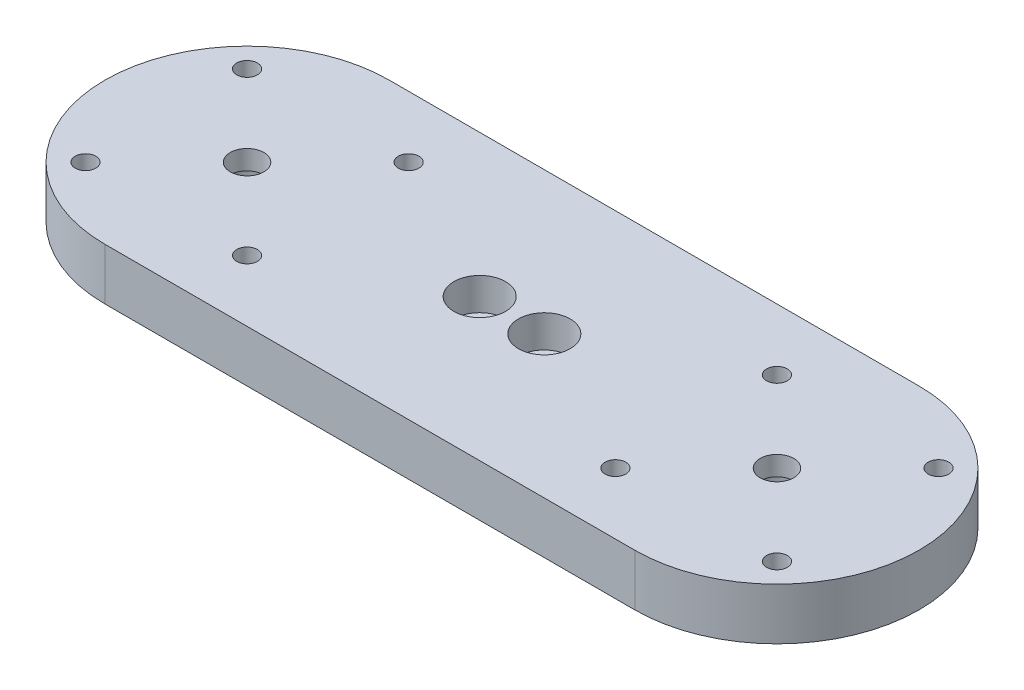
ISO-10303-21;
HEADER;
FILE_DESCRIPTION(('STEP AP214'),'2;1');
FILE_NAME('part.step','',(''),(''),'','','');
FILE_SCHEMA(('AUTOMOTIVE_DESIGN { 1 0 10303 214 1 1 1 1 }'));
ENDSEC;
DATA;
#1=APPLICATION_CONTEXT('core data for automotive mechanical design processes');
#2=APPLICATION_PROTOCOL_DEFINITION('international standard','automotive_design',2000,#1);
#3=PRODUCT_CONTEXT('',#1,'mechanical');
#4=PRODUCT('Part','Part','',(#3));
#5=PRODUCT_RELATED_PRODUCT_CATEGORY('part','',(#4));
#6=PRODUCT_DEFINITION_FORMATION('','',#4);
#7=PRODUCT_DEFINITION_CONTEXT('part definition',#1,'design');
#8=PRODUCT_DEFINITION('design','',#6,#7);
#9=PRODUCT_DEFINITION_SHAPE('','',#8);
#10=(LENGTH_UNIT() NAMED_UNIT(*) SI_UNIT(.MILLI.,.METRE.));
#11=(NAMED_UNIT(*) PLANE_ANGLE_UNIT() SI_UNIT($,.RADIAN.));
#12=(NAMED_UNIT(*) SI_UNIT($,.STERADIAN.) SOLID_ANGLE_UNIT());
#13=UNCERTAINTY_MEASURE_WITH_UNIT(LENGTH_MEASURE(1.E-05),#10,'distance_accuracy_value','');
#14=(GEOMETRIC_REPRESENTATION_CONTEXT(3) GLOBAL_UNCERTAINTY_ASSIGNED_CONTEXT((#13)) GLOBAL_UNIT_ASSIGNED_CONTEXT((#10,
#11,#12)) REPRESENTATION_CONTEXT('',''));
#15=CARTESIAN_POINT('',(0.,0.,0.));
#16=DIRECTION('',(0.,0.,1.));
#17=DIRECTION('',(1.,0.,0.));
#18=AXIS2_PLACEMENT_3D('',#15,#16,#17);
#19=CARTESIAN_POINT('',(36.,8.,0.));
#20=DIRECTION('',(0.,-1.,0.));
#21=DIRECTION('',(0.,0.,-1.));
#22=AXIS2_PLACEMENT_3D('',#19,#20,#21);
#23=CYLINDRICAL_SURFACE('',#22,1.6);
#24=CARTESIAN_POINT('',(36.,0.,0.));
#25=DIRECTION('',(0.,1.,0.));
#26=DIRECTION('',(0.,0.,1.));
#27=AXIS2_PLACEMENT_3D('',#24,#25,#26);
#28=CIRCLE('',#27,1.6);
#29=CARTESIAN_POINT('',(36.,0.,1.6));
#30=VERTEX_POINT('',#29);
#31=EDGE_CURVE('E154',#30,#30,#28,.T.);
#32=ORIENTED_EDGE('',*,*,#31,.F.);
#33=EDGE_LOOP('',(#32));
#34=FACE_BOUND('',#33,.T.);
#35=CARTESIAN_POINT('',(36.,3.,0.));
#36=DIRECTION('',(0.,1.,0.));
#37=DIRECTION('',(0.,0.,1.));
#38=AXIS2_PLACEMENT_3D('',#35,#36,#37);
#39=CIRCLE('',#38,1.6);
#40=CARTESIAN_POINT('',(36.,3.,1.6));
#41=VERTEX_POINT('',#40);
#42=EDGE_CURVE('E41',#41,#41,#39,.T.);
#43=ORIENTED_EDGE('',*,*,#42,.T.);
#44=EDGE_LOOP('',(#43));
#45=FACE_BOUND('',#44,.T.);
#46=ADVANCED_FACE('F37',(#34,#45),#23,.F.);
#47=CARTESIAN_POINT('',(46.,8.,0.));
#48=DIRECTION('',(0.,-1.,0.));
#49=DIRECTION('',(0.,0.,-1.));
#50=AXIS2_PLACEMENT_3D('',#47,#48,#49);
#51=CYLINDRICAL_SURFACE('',#50,1.6);
#52=CARTESIAN_POINT('',(46.,0.,0.));
#53=DIRECTION('',(0.,1.,0.));
#54=DIRECTION('',(0.,0.,-1.));
#55=AXIS2_PLACEMENT_3D('',#52,#53,#54);
#56=CIRCLE('',#55,1.6);
#57=CARTESIAN_POINT('',(46.,0.,-1.6));
#58=VERTEX_POINT('',#57);
#59=EDGE_CURVE('E120',#58,#58,#56,.T.);
#60=ORIENTED_EDGE('',*,*,#59,.F.);
#61=EDGE_LOOP('',(#60));
#62=FACE_BOUND('',#61,.T.);
#63=CARTESIAN_POINT('',(46.,3.,0.));
#64=DIRECTION('',(0.,1.,0.));
#65=DIRECTION('',(0.,0.,1.));
#66=AXIS2_PLACEMENT_3D('',#63,#64,#65);
#67=CIRCLE('',#66,1.6);
#68=CARTESIAN_POINT('',(46.,3.,1.6));
#69=VERTEX_POINT('',#68);
#70=EDGE_CURVE('E121',#69,#69,#67,.T.);
#71=ORIENTED_EDGE('',*,*,#70,.T.);
#72=EDGE_LOOP('',(#71));
#73=FACE_BOUND('',#72,.T.);
#74=ADVANCED_FACE('F230',(#62,#73),#51,.F.);
#75=CARTESIAN_POINT('',(0.,8.,0.));
#76=DIRECTION('',(0.,-1.,0.));
#77=DIRECTION('',(0.,0.,-1.));
#78=AXIS2_PLACEMENT_3D('',#75,#76,#77);
#79=CYLINDRICAL_SURFACE('',#78,2.6);
#80=CARTESIAN_POINT('',(0.,8.,0.));
#81=DIRECTION('',(0.,1.,0.));
#82=DIRECTION('',(0.,0.,1.));
#83=AXIS2_PLACEMENT_3D('',#80,#81,#82);
#84=CIRCLE('',#83,2.6);
#85=CARTESIAN_POINT('',(0.,8.,2.6));
#86=VERTEX_POINT('',#85);
#87=EDGE_CURVE('E182',#86,#86,#84,.T.);
#88=ORIENTED_EDGE('',*,*,#87,.T.);
#89=EDGE_LOOP('',(#88));
#90=FACE_BOUND('',#89,.T.);
#91=CARTESIAN_POINT('',(0.,5.,0.));
#92=DIRECTION('',(0.,-1.,0.));
#93=DIRECTION('',(0.,0.,-1.));
#94=AXIS2_PLACEMENT_3D('',#91,#92,#93);
#95=CIRCLE('',#94,2.6);
#96=CARTESIAN_POINT('',(0.,5.,-2.6));
#97=VERTEX_POINT('',#96);
#98=EDGE_CURVE('E117',#97,#97,#95,.T.);
#99=ORIENTED_EDGE('',*,*,#98,.T.);
#100=EDGE_LOOP('',(#99));
#101=FACE_BOUND('',#100,.T.);
#102=ADVANCED_FACE('F237',(#90,#101),#79,.F.);
#103=CARTESIAN_POINT('',(82.,8.,0.));
#104=DIRECTION('',(0.,-1.,0.));
#105=DIRECTION('',(0.,0.,-1.));
#106=AXIS2_PLACEMENT_3D('',#103,#104,#105);
#107=CYLINDRICAL_SURFACE('',#106,2.6);
#108=CARTESIAN_POINT('',(82.,8.,0.));
#109=DIRECTION('',(0.,1.,0.));
#110=DIRECTION('',(0.,0.,-1.));
#111=AXIS2_PLACEMENT_3D('',#108,#109,#110);
#112=CIRCLE('',#111,2.6);
#113=CARTESIAN_POINT('',(82.,8.,-2.6));
#114=VERTEX_POINT('',#113);
#115=EDGE_CURVE('E161',#114,#114,#112,.T.);
#116=ORIENTED_EDGE('',*,*,#115,.T.);
#117=EDGE_LOOP('',(#116));
#118=FACE_BOUND('',#117,.T.);
#119=CARTESIAN_POINT('',(82.,5.,0.));
#120=DIRECTION('',(0.,-1.,0.));
#121=DIRECTION('',(0.,0.,-1.));
#122=AXIS2_PLACEMENT_3D('',#119,#120,#121);
#123=CIRCLE('',#122,2.6);
#124=CARTESIAN_POINT('',(82.,5.,-2.6));
#125=VERTEX_POINT('',#124);
#126=EDGE_CURVE('E114',#125,#125,#123,.T.);
#127=ORIENTED_EDGE('',*,*,#126,.T.);
#128=EDGE_LOOP('',(#127));
#129=FACE_BOUND('',#128,.T.);
#130=ADVANCED_FACE('F250',(#118,#129),#107,.F.);
#131=CARTESIAN_POINT('',(0.,8.,0.));
#132=DIRECTION('',(0.,1.,0.));
#133=DIRECTION('',(0.,0.,1.));
#134=AXIS2_PLACEMENT_3D('',#131,#132,#133);
#135=PLANE('',#134);
#136=CARTESIAN_POINT('',(36.,8.,0.));
#137=DIRECTION('',(0.,1.,0.));
#138=DIRECTION('',(0.,0.,1.));
#139=AXIS2_PLACEMENT_3D('',#136,#137,#138);
#140=CIRCLE('',#139,4.00000000000001);
#141=CARTESIAN_POINT('',(36.,8.,4.00000000000001));
#142=VERTEX_POINT('',#141);
#143=EDGE_CURVE('E129',#142,#142,#140,.T.);
#144=ORIENTED_EDGE('',*,*,#143,.F.);
#145=EDGE_LOOP('',(#144));
#146=FACE_BOUND('',#145,.T.);
#147=CARTESIAN_POINT('',(46.,8.,0.));
#148=DIRECTION('',(0.,1.,0.));
#149=DIRECTION('',(0.,0.,1.));
#150=AXIS2_PLACEMENT_3D('',#147,#148,#149);
#151=CIRCLE('',#150,4.);
#152=CARTESIAN_POINT('',(46.,8.,4.));
#153=VERTEX_POINT('',#152);
#154=EDGE_CURVE('E139',#153,#153,#151,.T.);
#155=ORIENTED_EDGE('',*,*,#154,.F.);
#156=EDGE_LOOP('',(#155));
#157=FACE_BOUND('',#156,.T.);
#158=ORIENTED_EDGE('',*,*,#115,.F.);
#159=EDGE_LOOP('',(#158));
#160=FACE_BOUND('',#159,.T.);
#161=CARTESIAN_POINT('',(69.5,8.,12.5000000000001));
#162=DIRECTION('',(0.,1.,0.));
#163=DIRECTION('',(0.,0.,1.));
#164=AXIS2_PLACEMENT_3D('',#161,#162,#163);
#165=CIRCLE('',#164,1.59999999999999);
#166=CARTESIAN_POINT('',(69.5,8.,14.1000000000001));
#167=VERTEX_POINT('',#166);
#168=EDGE_CURVE('E173',#167,#167,#165,.T.);
#169=ORIENTED_EDGE('',*,*,#168,.F.);
#170=EDGE_LOOP('',(#169));
#171=FACE_BOUND('',#170,.T.);
#172=ORIENTED_EDGE('',*,*,#87,.F.);
#173=EDGE_LOOP('',(#172));
#174=FACE_BOUND('',#173,.T.);
#175=CARTESIAN_POINT('',(12.5,8.,12.5000000000001));
#176=DIRECTION('',(0.,1.,0.));
#177=DIRECTION('',(0.,0.,-1.));
#178=AXIS2_PLACEMENT_3D('',#175,#176,#177);
#179=CIRCLE('',#178,1.6);
#180=CARTESIAN_POINT('',(12.5,8.,10.9000000000001));
#181=VERTEX_POINT('',#180);
#182=EDGE_CURVE('E194',#181,#181,#179,.T.);
#183=ORIENTED_EDGE('',*,*,#182,.F.);
#184=EDGE_LOOP('',(#183));
#185=FACE_BOUND('',#184,.T.);
#186=CARTESIAN_POINT('',(12.5,8.,-12.5000000000001));
#187=DIRECTION('',(0.,1.,0.));
#188=DIRECTION('',(0.,0.,1.));
#189=AXIS2_PLACEMENT_3D('',#186,#187,#188);
#190=CIRCLE('',#189,1.6);
#191=CARTESIAN_POINT('',(12.5,8.,-10.9000000000001));
#192=VERTEX_POINT('',#191);
#193=EDGE_CURVE('E108',#192,#192,#190,.T.);
#194=ORIENTED_EDGE('',*,*,#193,.F.);
#195=EDGE_LOOP('',(#194));
#196=FACE_BOUND('',#195,.T.);
#197=CARTESIAN_POINT('',(0.,8.,0.));
#198=DIRECTION('',(0.,1.,0.));
#199=DIRECTION('',(0.,0.,1.));
#200=AXIS2_PLACEMENT_3D('',#197,#198,#199);
#201=CIRCLE('',#200,22.);
#202=CARTESIAN_POINT('',(0.,8.,-22.));
#203=VERTEX_POINT('',#202);
#204=CARTESIAN_POINT('',(0.,8.,22.));
#205=VERTEX_POINT('',#204);
#206=EDGE_CURVE('E92',#203,#205,#201,.T.);
#207=ORIENTED_EDGE('',*,*,#206,.T.);
#208=DIRECTION('',(1.,0.,0.));
#209=VECTOR('',#208,1.);
#210=CARTESIAN_POINT('',(0.,8.,22.));
#211=LINE('',#210,#209);
#212=CARTESIAN_POINT('',(82.,8.,22.));
#213=VERTEX_POINT('',#212);
#214=EDGE_CURVE('E86',#205,#213,#211,.T.);
#215=ORIENTED_EDGE('',*,*,#214,.T.);
#216=CARTESIAN_POINT('',(82.,8.,0.));
#217=DIRECTION('',(0.,1.,0.));
#218=DIRECTION('',(0.,0.,1.));
#219=AXIS2_PLACEMENT_3D('',#216,#217,#218);
#220=CIRCLE('',#219,22.);
#221=CARTESIAN_POINT('',(82.,8.,-22.));
#222=VERTEX_POINT('',#221);
#223=EDGE_CURVE('E90',#213,#222,#220,.T.);
#224=ORIENTED_EDGE('',*,*,#223,.T.);
#225=DIRECTION('',(-1.,0.,0.));
#226=VECTOR('',#225,1.);
#227=CARTESIAN_POINT('',(0.,8.,-22.));
#228=LINE('',#227,#226);
#229=EDGE_CURVE('E56',#222,#203,#228,.T.);
#230=ORIENTED_EDGE('',*,*,#229,.T.);
#231=EDGE_LOOP('',(#207,#215,#224,#230));
#232=FACE_BOUND('',#231,.T.);
#233=CARTESIAN_POINT('',(-12.5,8.,-12.5000000000001));
#234=DIRECTION('',(0.,1.,0.));
#235=DIRECTION('',(0.,0.,-1.));
#236=AXIS2_PLACEMENT_3D('',#233,#234,#235);
#237=CIRCLE('',#236,1.6);
#238=CARTESIAN_POINT('',(-12.5,8.,-14.1000000000001));
#239=VERTEX_POINT('',#238);
#240=EDGE_CURVE('E200',#239,#239,#237,.T.);
#241=ORIENTED_EDGE('',*,*,#240,.F.);
#242=EDGE_LOOP('',(#241));
#243=FACE_BOUND('',#242,.T.);
#244=CARTESIAN_POINT('',(-12.5,8.,12.5000000000001));
#245=DIRECTION('',(0.,1.,0.));
#246=DIRECTION('',(0.,0.,1.));
#247=AXIS2_PLACEMENT_3D('',#244,#245,#246);
#248=CIRCLE('',#247,1.6);
#249=CARTESIAN_POINT('',(-12.5,8.,14.1000000000001));
#250=VERTEX_POINT('',#249);
#251=EDGE_CURVE('E188',#250,#250,#248,.T.);
#252=ORIENTED_EDGE('',*,*,#251,.F.);
#253=EDGE_LOOP('',(#252));
#254=FACE_BOUND('',#253,.T.);
#255=CARTESIAN_POINT('',(94.5,8.,12.5000000000001));
#256=DIRECTION('',(0.,1.,0.));
#257=DIRECTION('',(0.,0.,-1.));
#258=AXIS2_PLACEMENT_3D('',#255,#256,#257);
#259=CIRCLE('',#258,1.59999999999999);
#260=CARTESIAN_POINT('',(94.5,8.,10.9000000000001));
#261=VERTEX_POINT('',#260);
#262=EDGE_CURVE('E179',#261,#261,#259,.T.);
#263=ORIENTED_EDGE('',*,*,#262,.F.);
#264=EDGE_LOOP('',(#263));
#265=FACE_BOUND('',#264,.T.);
#266=CARTESIAN_POINT('',(69.5,8.,-12.5000000000001));
#267=DIRECTION('',(0.,1.,0.));
#268=DIRECTION('',(0.,0.,-1.));
#269=AXIS2_PLACEMENT_3D('',#266,#267,#268);
#270=CIRCLE('',#269,1.59999999999999);
#271=CARTESIAN_POINT('',(69.5,8.,-14.1000000000001));
#272=VERTEX_POINT('',#271);
#273=EDGE_CURVE('E167',#272,#272,#270,.T.);
#274=ORIENTED_EDGE('',*,*,#273,.F.);
#275=EDGE_LOOP('',(#274));
#276=FACE_BOUND('',#275,.T.);
#277=CARTESIAN_POINT('',(94.5,8.,-12.5000000000001));
#278=DIRECTION('',(0.,1.,0.));
#279=DIRECTION('',(0.,0.,1.));
#280=AXIS2_PLACEMENT_3D('',#277,#278,#279);
#281=CIRCLE('',#280,1.59999999999999);
#282=CARTESIAN_POINT('',(94.5,8.,-10.9000000000001));
#283=VERTEX_POINT('',#282);
#284=EDGE_CURVE('E158',#283,#283,#281,.T.);
#285=ORIENTED_EDGE('',*,*,#284,.F.);
#286=EDGE_LOOP('',(#285));
#287=FACE_BOUND('',#286,.T.);
#288=ADVANCED_FACE('F87',(#146,#157,#160,#171,#174,#185,#196,#232,#243,#254,#265,#276,#287),
#135,.T.);
#289=CARTESIAN_POINT('',(0.,0.,0.));
#290=DIRECTION('',(0.,1.,0.));
#291=DIRECTION('',(0.,0.,1.));
#292=AXIS2_PLACEMENT_3D('',#289,#290,#291);
#293=PLANE('',#292);
#294=CARTESIAN_POINT('',(0.,0.,0.));
#295=DIRECTION('',(0.,-1.,0.));
#296=DIRECTION('',(0.,0.,-1.));
#297=AXIS2_PLACEMENT_3D('',#294,#295,#296);
#298=CIRCLE('',#297,4.5);
#299=CARTESIAN_POINT('',(0.,0.,-4.5));
#300=VERTEX_POINT('',#299);
#301=EDGE_CURVE('E144',#300,#300,#298,.T.);
#302=ORIENTED_EDGE('',*,*,#301,.F.);
#303=EDGE_LOOP('',(#302));
#304=FACE_BOUND('',#303,.T.);
#305=CARTESIAN_POINT('',(82.,0.,0.));
#306=DIRECTION('',(0.,-1.,0.));
#307=DIRECTION('',(0.,0.,-1.));
#308=AXIS2_PLACEMENT_3D('',#305,#306,#307);
#309=CIRCLE('',#308,4.5);
#310=CARTESIAN_POINT('',(82.,0.,-4.5));
#311=VERTEX_POINT('',#310);
#312=EDGE_CURVE('E127',#311,#311,#309,.T.);
#313=ORIENTED_EDGE('',*,*,#312,.F.);
#314=EDGE_LOOP('',(#313));
#315=FACE_BOUND('',#314,.T.);
#316=CARTESIAN_POINT('',(0.,0.,0.));
#317=DIRECTION('',(0.,1.,0.));
#318=DIRECTION('',(0.,0.,1.));
#319=AXIS2_PLACEMENT_3D('',#316,#317,#318);
#320=CIRCLE('',#319,22.);
#321=CARTESIAN_POINT('',(0.,0.,-22.));
#322=VERTEX_POINT('',#321);
#323=CARTESIAN_POINT('',(0.,0.,22.));
#324=VERTEX_POINT('',#323);
#325=EDGE_CURVE('E105',#322,#324,#320,.T.);
#326=ORIENTED_EDGE('',*,*,#325,.F.);
#327=DIRECTION('',(-1.,0.,0.));
#328=VECTOR('',#327,1.);
#329=CARTESIAN_POINT('',(0.,0.,-22.));
#330=LINE('',#329,#328);
#331=CARTESIAN_POINT('',(82.,0.,-22.));
#332=VERTEX_POINT('',#331);
#333=EDGE_CURVE('E79',#332,#322,#330,.T.);
#334=ORIENTED_EDGE('',*,*,#333,.F.);
#335=CARTESIAN_POINT('',(82.,0.,0.));
#336=DIRECTION('',(0.,1.,0.));
#337=DIRECTION('',(0.,0.,1.));
#338=AXIS2_PLACEMENT_3D('',#335,#336,#337);
#339=CIRCLE('',#338,22.);
#340=CARTESIAN_POINT('',(82.,0.,22.));
#341=VERTEX_POINT('',#340);
#342=EDGE_CURVE('E73',#341,#332,#339,.T.);
#343=ORIENTED_EDGE('',*,*,#342,.F.);
#344=DIRECTION('',(1.,0.,0.));
#345=VECTOR('',#344,1.);
#346=CARTESIAN_POINT('',(0.,0.,22.));
#347=LINE('',#346,#345);
#348=EDGE_CURVE('E96',#324,#341,#347,.T.);
#349=ORIENTED_EDGE('',*,*,#348,.F.);
#350=EDGE_LOOP('',(#326,#334,#343,#349));
#351=FACE_BOUND('',#350,.T.);
#352=CARTESIAN_POINT('',(12.5,0.,-12.5000000000001));
#353=DIRECTION('',(0.,1.,0.));
#354=DIRECTION('',(0.,0.,1.));
#355=AXIS2_PLACEMENT_3D('',#352,#353,#354);
#356=CIRCLE('',#355,1.6);
#357=CARTESIAN_POINT('',(12.5,0.,-10.9000000000001));
#358=VERTEX_POINT('',#357);
#359=EDGE_CURVE('E203',#358,#358,#356,.T.);
#360=ORIENTED_EDGE('',*,*,#359,.T.);
#361=EDGE_LOOP('',(#360));
#362=FACE_BOUND('',#361,.T.);
#363=CARTESIAN_POINT('',(-12.5,0.,-12.5000000000001));
#364=DIRECTION('',(0.,1.,0.));
#365=DIRECTION('',(0.,0.,-1.));
#366=AXIS2_PLACEMENT_3D('',#363,#364,#365);
#367=CIRCLE('',#366,1.6);
#368=CARTESIAN_POINT('',(-12.5,0.,-14.1000000000001));
#369=VERTEX_POINT('',#368);
#370=EDGE_CURVE('E197',#369,#369,#367,.T.);
#371=ORIENTED_EDGE('',*,*,#370,.T.);
#372=EDGE_LOOP('',(#371));
#373=FACE_BOUND('',#372,.T.);
#374=CARTESIAN_POINT('',(12.5,0.,12.5000000000001));
#375=DIRECTION('',(0.,1.,0.));
#376=DIRECTION('',(0.,0.,-1.));
#377=AXIS2_PLACEMENT_3D('',#374,#375,#376);
#378=CIRCLE('',#377,1.6);
#379=CARTESIAN_POINT('',(12.5,0.,10.9000000000001));
#380=VERTEX_POINT('',#379);
#381=EDGE_CURVE('E191',#380,#380,#378,.T.);
#382=ORIENTED_EDGE('',*,*,#381,.T.);
#383=EDGE_LOOP('',(#382));
#384=FACE_BOUND('',#383,.T.);
#385=CARTESIAN_POINT('',(-12.5,0.,12.5000000000001));
#386=DIRECTION('',(0.,1.,0.));
#387=DIRECTION('',(0.,0.,1.));
#388=AXIS2_PLACEMENT_3D('',#385,#386,#387);
#389=CIRCLE('',#388,1.6);
#390=CARTESIAN_POINT('',(-12.5,0.,14.1000000000001));
#391=VERTEX_POINT('',#390);
#392=EDGE_CURVE('E187',#391,#391,#389,.T.);
#393=ORIENTED_EDGE('',*,*,#392,.T.);
#394=EDGE_LOOP('',(#393));
#395=FACE_BOUND('',#394,.T.);
#396=CARTESIAN_POINT('',(94.5,0.,12.5000000000001));
#397=DIRECTION('',(0.,1.,0.));
#398=DIRECTION('',(0.,0.,-1.));
#399=AXIS2_PLACEMENT_3D('',#396,#397,#398);
#400=CIRCLE('',#399,1.59999999999999);
#401=CARTESIAN_POINT('',(94.5,0.,10.9000000000001));
#402=VERTEX_POINT('',#401);
#403=EDGE_CURVE('E176',#402,#402,#400,.T.);
#404=ORIENTED_EDGE('',*,*,#403,.T.);
#405=EDGE_LOOP('',(#404));
#406=FACE_BOUND('',#405,.T.);
#407=CARTESIAN_POINT('',(69.5,0.,12.5000000000001));
#408=DIRECTION('',(0.,1.,0.));
#409=DIRECTION('',(0.,0.,1.));
#410=AXIS2_PLACEMENT_3D('',#407,#408,#409);
#411=CIRCLE('',#410,1.59999999999999);
#412=CARTESIAN_POINT('',(69.5,0.,14.1000000000001));
#413=VERTEX_POINT('',#412);
#414=EDGE_CURVE('E170',#413,#413,#411,.T.);
#415=ORIENTED_EDGE('',*,*,#414,.T.);
#416=EDGE_LOOP('',(#415));
#417=FACE_BOUND('',#416,.T.);
#418=CARTESIAN_POINT('',(69.5,0.,-12.5000000000001));
#419=DIRECTION('',(0.,1.,0.));
#420=DIRECTION('',(0.,0.,-1.));
#421=AXIS2_PLACEMENT_3D('',#418,#419,#420);
#422=CIRCLE('',#421,1.59999999999999);
#423=CARTESIAN_POINT('',(69.5,0.,-14.1000000000001));
#424=VERTEX_POINT('',#423);
#425=EDGE_CURVE('E166',#424,#424,#422,.T.);
#426=ORIENTED_EDGE('',*,*,#425,.T.);
#427=EDGE_LOOP('',(#426));
#428=FACE_BOUND('',#427,.T.);
#429=CARTESIAN_POINT('',(94.5,0.,-12.5000000000001));
#430=DIRECTION('',(0.,1.,0.));
#431=DIRECTION('',(0.,0.,1.));
#432=AXIS2_PLACEMENT_3D('',#429,#430,#431);
#433=CIRCLE('',#432,1.59999999999999);
#434=CARTESIAN_POINT('',(94.5,0.,-10.9000000000001));
#435=VERTEX_POINT('',#434);
#436=EDGE_CURVE('E157',#435,#435,#433,.T.);
#437=ORIENTED_EDGE('',*,*,#436,.T.);
#438=EDGE_LOOP('',(#437));
#439=FACE_BOUND('',#438,.T.);
#440=ORIENTED_EDGE('',*,*,#31,.T.);
#441=EDGE_LOOP('',(#440));
#442=FACE_BOUND('',#441,.T.);
#443=ORIENTED_EDGE('',*,*,#59,.T.);
#444=EDGE_LOOP('',(#443));
#445=FACE_BOUND('',#444,.T.);
#446=ADVANCED_FACE('F211',(#304,#315,#351,#362,#373,#384,#395,#406,#417,#428,#439,#442,#445),
#293,.F.);
#447=CARTESIAN_POINT('',(0.,8.,0.));
#448=DIRECTION('',(0.,-1.,0.));
#449=DIRECTION('',(0.,0.,-1.));
#450=AXIS2_PLACEMENT_3D('',#447,#448,#449);
#451=CYLINDRICAL_SURFACE('',#450,22.);
#452=ORIENTED_EDGE('',*,*,#325,.T.);
#453=DIRECTION('',(0.,-1.,0.));
#454=VECTOR('',#453,1.);
#455=CARTESIAN_POINT('',(0.,8.,22.));
#456=LINE('',#455,#454);
#457=EDGE_CURVE('E11',#205,#324,#456,.T.);
#458=ORIENTED_EDGE('',*,*,#457,.F.);
#459=ORIENTED_EDGE('',*,*,#206,.F.);
#460=DIRECTION('',(0.,-1.,0.));
#461=VECTOR('',#460,1.);
#462=CARTESIAN_POINT('',(0.,8.,-22.));
#463=LINE('',#462,#461);
#464=EDGE_CURVE('E101',#203,#322,#463,.T.);
#465=ORIENTED_EDGE('',*,*,#464,.T.);
#466=EDGE_LOOP('',(#452,#458,#459,#465));
#467=FACE_BOUND('',#466,.T.);
#468=ADVANCED_FACE('F39',(#467),#451,.T.);
#469=CARTESIAN_POINT('',(0.,8.,22.));
#470=DIRECTION('',(0.,0.,-1.));
#471=DIRECTION('',(-1.,0.,0.));
#472=AXIS2_PLACEMENT_3D('',#469,#470,#471);
#473=PLANE('',#472);
#474=ORIENTED_EDGE('',*,*,#348,.T.);
#475=DIRECTION('',(0.,-1.,0.));
#476=VECTOR('',#475,1.);
#477=CARTESIAN_POINT('',(82.,8.,22.));
#478=LINE('',#477,#476);
#479=EDGE_CURVE('E47',#213,#341,#478,.T.);
#480=ORIENTED_EDGE('',*,*,#479,.F.);
#481=ORIENTED_EDGE('',*,*,#214,.F.);
#482=ORIENTED_EDGE('',*,*,#457,.T.);
#483=EDGE_LOOP('',(#474,#480,#481,#482));
#484=FACE_BOUND('',#483,.T.);
#485=ADVANCED_FACE('F95',(#484),#473,.F.);
#486=CARTESIAN_POINT('',(82.,8.,0.));
#487=DIRECTION('',(0.,-1.,0.));
#488=DIRECTION('',(0.,0.,-1.));
#489=AXIS2_PLACEMENT_3D('',#486,#487,#488);
#490=CYLINDRICAL_SURFACE('',#489,22.);
#491=ORIENTED_EDGE('',*,*,#342,.T.);
#492=DIRECTION('',(0.,-1.,0.));
#493=VECTOR('',#492,1.);
#494=CARTESIAN_POINT('',(82.,8.,-22.));
#495=LINE('',#494,#493);
#496=EDGE_CURVE('E97',#222,#332,#495,.T.);
#497=ORIENTED_EDGE('',*,*,#496,.F.);
#498=ORIENTED_EDGE('',*,*,#223,.F.);
#499=ORIENTED_EDGE('',*,*,#479,.T.);
#500=EDGE_LOOP('',(#491,#497,#498,#499));
#501=FACE_BOUND('',#500,.T.);
#502=ADVANCED_FACE('F99',(#501),#490,.T.);
#503=CARTESIAN_POINT('',(0.,8.,-22.));
#504=DIRECTION('',(0.,0.,1.));
#505=DIRECTION('',(1.,0.,0.));
#506=AXIS2_PLACEMENT_3D('',#503,#504,#505);
#507=PLANE('',#506);
#508=ORIENTED_EDGE('',*,*,#333,.T.);
#509=ORIENTED_EDGE('',*,*,#464,.F.);
#510=ORIENTED_EDGE('',*,*,#229,.F.);
#511=ORIENTED_EDGE('',*,*,#496,.T.);
#512=EDGE_LOOP('',(#508,#509,#510,#511));
#513=FACE_BOUND('',#512,.T.);
#514=ADVANCED_FACE('F217',(#513),#507,.F.);
#515=CARTESIAN_POINT('',(12.5,8.,-12.5000000000001));
#516=DIRECTION('',(0.,-1.,0.));
#517=DIRECTION('',(0.,0.,-1.));
#518=AXIS2_PLACEMENT_3D('',#515,#516,#517);
#519=CYLINDRICAL_SURFACE('',#518,1.6);
#520=ORIENTED_EDGE('',*,*,#193,.T.);
#521=EDGE_LOOP('',(#520));
#522=FACE_BOUND('',#521,.T.);
#523=ORIENTED_EDGE('',*,*,#359,.F.);
#524=EDGE_LOOP('',(#523));
#525=FACE_BOUND('',#524,.T.);
#526=ADVANCED_FACE('F214',(#522,#525),#519,.F.);
#527=CARTESIAN_POINT('',(-12.5,8.,-12.5000000000001));
#528=DIRECTION('',(0.,-1.,0.));
#529=DIRECTION('',(0.,0.,-1.));
#530=AXIS2_PLACEMENT_3D('',#527,#528,#529);
#531=CYLINDRICAL_SURFACE('',#530,1.6);
#532=ORIENTED_EDGE('',*,*,#240,.T.);
#533=EDGE_LOOP('',(#532));
#534=FACE_BOUND('',#533,.T.);
#535=ORIENTED_EDGE('',*,*,#370,.F.);
#536=EDGE_LOOP('',(#535));
#537=FACE_BOUND('',#536,.T.);
#538=ADVANCED_FACE('F216',(#534,#537),#531,.F.);
#539=CARTESIAN_POINT('',(12.5,8.,12.5000000000001));
#540=DIRECTION('',(0.,-1.,0.));
#541=DIRECTION('',(0.,0.,-1.));
#542=AXIS2_PLACEMENT_3D('',#539,#540,#541);
#543=CYLINDRICAL_SURFACE('',#542,1.6);
#544=ORIENTED_EDGE('',*,*,#182,.T.);
#545=EDGE_LOOP('',(#544));
#546=FACE_BOUND('',#545,.T.);
#547=ORIENTED_EDGE('',*,*,#381,.F.);
#548=EDGE_LOOP('',(#547));
#549=FACE_BOUND('',#548,.T.);
#550=ADVANCED_FACE('F224',(#546,#549),#543,.F.);
#551=CARTESIAN_POINT('',(-12.5,8.,12.5000000000001));
#552=DIRECTION('',(0.,-1.,0.));
#553=DIRECTION('',(0.,0.,-1.));
#554=AXIS2_PLACEMENT_3D('',#551,#552,#553);
#555=CYLINDRICAL_SURFACE('',#554,1.6);
#556=ORIENTED_EDGE('',*,*,#251,.T.);
#557=EDGE_LOOP('',(#556));
#558=FACE_BOUND('',#557,.T.);
#559=ORIENTED_EDGE('',*,*,#392,.F.);
#560=EDGE_LOOP('',(#559));
#561=FACE_BOUND('',#560,.T.);
#562=ADVANCED_FACE('F264',(#558,#561),#555,.F.);
#563=CARTESIAN_POINT('',(94.5,8.,12.5000000000001));
#564=DIRECTION('',(0.,-1.,0.));
#565=DIRECTION('',(0.,0.,-1.));
#566=AXIS2_PLACEMENT_3D('',#563,#564,#565);
#567=CYLINDRICAL_SURFACE('',#566,1.59999999999999);
#568=ORIENTED_EDGE('',*,*,#262,.T.);
#569=EDGE_LOOP('',(#568));
#570=FACE_BOUND('',#569,.T.);
#571=ORIENTED_EDGE('',*,*,#403,.F.);
#572=EDGE_LOOP('',(#571));
#573=FACE_BOUND('',#572,.T.);
#574=ADVANCED_FACE('F260',(#570,#573),#567,.F.);
#575=CARTESIAN_POINT('',(69.5,8.,12.5000000000001));
#576=DIRECTION('',(0.,-1.,0.));
#577=DIRECTION('',(0.,0.,-1.));
#578=AXIS2_PLACEMENT_3D('',#575,#576,#577);
#579=CYLINDRICAL_SURFACE('',#578,1.59999999999999);
#580=ORIENTED_EDGE('',*,*,#168,.T.);
#581=EDGE_LOOP('',(#580));
#582=FACE_BOUND('',#581,.T.);
#583=ORIENTED_EDGE('',*,*,#414,.F.);
#584=EDGE_LOOP('',(#583));
#585=FACE_BOUND('',#584,.T.);
#586=ADVANCED_FACE('F256',(#582,#585),#579,.F.);
#587=CARTESIAN_POINT('',(69.5,8.,-12.5000000000001));
#588=DIRECTION('',(0.,-1.,0.));
#589=DIRECTION('',(0.,0.,-1.));
#590=AXIS2_PLACEMENT_3D('',#587,#588,#589);
#591=CYLINDRICAL_SURFACE('',#590,1.59999999999999);
#592=ORIENTED_EDGE('',*,*,#273,.T.);
#593=EDGE_LOOP('',(#592));
#594=FACE_BOUND('',#593,.T.);
#595=ORIENTED_EDGE('',*,*,#425,.F.);
#596=EDGE_LOOP('',(#595));
#597=FACE_BOUND('',#596,.T.);
#598=ADVANCED_FACE('F248',(#594,#597),#591,.F.);
#599=CARTESIAN_POINT('',(94.5,8.,-12.5000000000001));
#600=DIRECTION('',(0.,-1.,0.));
#601=DIRECTION('',(0.,0.,-1.));
#602=AXIS2_PLACEMENT_3D('',#599,#600,#601);
#603=CYLINDRICAL_SURFACE('',#602,1.59999999999999);
#604=ORIENTED_EDGE('',*,*,#284,.T.);
#605=EDGE_LOOP('',(#604));
#606=FACE_BOUND('',#605,.T.);
#607=ORIENTED_EDGE('',*,*,#436,.F.);
#608=EDGE_LOOP('',(#607));
#609=FACE_BOUND('',#608,.T.);
#610=ADVANCED_FACE('F244',(#606,#609),#603,.F.);
#611=CARTESIAN_POINT('',(82.,5.,0.));
#612=DIRECTION('',(0.,-1.,0.));
#613=DIRECTION('',(0.,0.,-1.));
#614=AXIS2_PLACEMENT_3D('',#611,#612,#613);
#615=CYLINDRICAL_SURFACE('',#614,4.5);
#616=CARTESIAN_POINT('',(82.,5.,0.));
#617=DIRECTION('',(0.,-1.,0.));
#618=DIRECTION('',(0.,0.,-1.));
#619=AXIS2_PLACEMENT_3D('',#616,#617,#618);
#620=CIRCLE('',#619,4.5);
#621=CARTESIAN_POINT('',(82.,5.,-4.5));
#622=VERTEX_POINT('',#621);
#623=EDGE_CURVE('E147',#622,#622,#620,.T.);
#624=ORIENTED_EDGE('',*,*,#623,.F.);
#625=EDGE_LOOP('',(#624));
#626=FACE_BOUND('',#625,.T.);
#627=ORIENTED_EDGE('',*,*,#312,.T.);
#628=EDGE_LOOP('',(#627));
#629=FACE_BOUND('',#628,.T.);
#630=ADVANCED_FACE('F247',(#626,#629),#615,.F.);
#631=CARTESIAN_POINT('',(82.,5.,0.));
#632=DIRECTION('',(0.,-1.,0.));
#633=DIRECTION('',(0.,0.,-1.));
#634=AXIS2_PLACEMENT_3D('',#631,#632,#633);
#635=PLANE('',#634);
#636=ORIENTED_EDGE('',*,*,#126,.F.);
#637=EDGE_LOOP('',(#636));
#638=FACE_BOUND('',#637,.T.);
#639=ORIENTED_EDGE('',*,*,#623,.T.);
#640=EDGE_LOOP('',(#639));
#641=FACE_BOUND('',#640,.T.);
#642=ADVANCED_FACE('F402',(#638,#641),#635,.T.);
#643=CARTESIAN_POINT('',(0.,5.,0.));
#644=DIRECTION('',(0.,-1.,0.));
#645=DIRECTION('',(0.,0.,-1.));
#646=AXIS2_PLACEMENT_3D('',#643,#644,#645);
#647=CYLINDRICAL_SURFACE('',#646,4.5);
#648=CARTESIAN_POINT('',(0.,5.,0.));
#649=DIRECTION('',(0.,-1.,0.));
#650=DIRECTION('',(0.,0.,-1.));
#651=AXIS2_PLACEMENT_3D('',#648,#649,#650);
#652=CIRCLE('',#651,4.5);
#653=CARTESIAN_POINT('',(0.,5.,-4.5));
#654=VERTEX_POINT('',#653);
#655=EDGE_CURVE('E118',#654,#654,#652,.T.);
#656=ORIENTED_EDGE('',*,*,#655,.F.);
#657=EDGE_LOOP('',(#656));
#658=FACE_BOUND('',#657,.T.);
#659=ORIENTED_EDGE('',*,*,#301,.T.);
#660=EDGE_LOOP('',(#659));
#661=FACE_BOUND('',#660,.T.);
#662=ADVANCED_FACE('F411',(#658,#661),#647,.F.);
#663=CARTESIAN_POINT('',(0.,5.,0.));
#664=DIRECTION('',(0.,-1.,0.));
#665=DIRECTION('',(0.,0.,-1.));
#666=AXIS2_PLACEMENT_3D('',#663,#664,#665);
#667=PLANE('',#666);
#668=ORIENTED_EDGE('',*,*,#98,.F.);
#669=EDGE_LOOP('',(#668));
#670=FACE_BOUND('',#669,.T.);
#671=ORIENTED_EDGE('',*,*,#655,.T.);
#672=EDGE_LOOP('',(#671));
#673=FACE_BOUND('',#672,.T.);
#674=ADVANCED_FACE('F420',(#670,#673),#667,.T.);
#675=CARTESIAN_POINT('',(46.,3.,0.));
#676=DIRECTION('',(0.,1.,0.));
#677=DIRECTION('',(0.,0.,1.));
#678=AXIS2_PLACEMENT_3D('',#675,#676,#677);
#679=CYLINDRICAL_SURFACE('',#678,4.);
#680=CARTESIAN_POINT('',(46.,3.,0.));
#681=DIRECTION('',(0.,1.,0.));
#682=DIRECTION('',(0.,0.,1.));
#683=AXIS2_PLACEMENT_3D('',#680,#681,#682);
#684=CIRCLE('',#683,4.);
#685=CARTESIAN_POINT('',(46.,3.,4.));
#686=VERTEX_POINT('',#685);
#687=EDGE_CURVE('E134',#686,#686,#684,.T.);
#688=ORIENTED_EDGE('',*,*,#687,.F.);
#689=EDGE_LOOP('',(#688));
#690=FACE_BOUND('',#689,.T.);
#691=ORIENTED_EDGE('',*,*,#154,.T.);
#692=EDGE_LOOP('',(#691));
#693=FACE_BOUND('',#692,.T.);
#694=ADVANCED_FACE('F429',(#690,#693),#679,.F.);
#695=CARTESIAN_POINT('',(46.,3.,0.));
#696=DIRECTION('',(0.,1.,0.));
#697=DIRECTION('',(0.,0.,1.));
#698=AXIS2_PLACEMENT_3D('',#695,#696,#697);
#699=PLANE('',#698);
#700=ORIENTED_EDGE('',*,*,#70,.F.);
#701=EDGE_LOOP('',(#700));
#702=FACE_BOUND('',#701,.T.);
#703=ORIENTED_EDGE('',*,*,#687,.T.);
#704=EDGE_LOOP('',(#703));
#705=FACE_BOUND('',#704,.T.);
#706=ADVANCED_FACE('F449',(#702,#705),#699,.T.);
#707=CARTESIAN_POINT('',(36.,3.,0.));
#708=DIRECTION('',(0.,1.,0.));
#709=DIRECTION('',(0.,0.,1.));
#710=AXIS2_PLACEMENT_3D('',#707,#708,#709);
#711=CYLINDRICAL_SURFACE('',#710,4.00000000000001);
#712=CARTESIAN_POINT('',(36.,3.,0.));
#713=DIRECTION('',(0.,1.,0.));
#714=DIRECTION('',(0.,0.,1.));
#715=AXIS2_PLACEMENT_3D('',#712,#713,#714);
#716=CIRCLE('',#715,4.00000000000001);
#717=CARTESIAN_POINT('',(36.,3.,4.00000000000001));
#718=VERTEX_POINT('',#717);
#719=EDGE_CURVE('E123',#718,#718,#716,.T.);
#720=ORIENTED_EDGE('',*,*,#719,.F.);
#721=EDGE_LOOP('',(#720));
#722=FACE_BOUND('',#721,.T.);
#723=ORIENTED_EDGE('',*,*,#143,.T.);
#724=EDGE_LOOP('',(#723));
#725=FACE_BOUND('',#724,.T.);
#726=ADVANCED_FACE('F456',(#722,#725),#711,.F.);
#727=CARTESIAN_POINT('',(36.,3.,0.));
#728=DIRECTION('',(0.,1.,0.));
#729=DIRECTION('',(0.,0.,1.));
#730=AXIS2_PLACEMENT_3D('',#727,#728,#729);
#731=PLANE('',#730);
#732=ORIENTED_EDGE('',*,*,#42,.F.);
#733=EDGE_LOOP('',(#732));
#734=FACE_BOUND('',#733,.T.);
#735=ORIENTED_EDGE('',*,*,#719,.T.);
#736=EDGE_LOOP('',(#735));
#737=FACE_BOUND('',#736,.T.);
#738=ADVANCED_FACE('F464',(#734,#737),#731,.T.);
#739=CLOSED_SHELL('',(#46,#74,#102,#130,#288,#446,#468,#485,#502,#514,#526,#538,#550,#562,#574,
#586,#598,#610,#630,#642,#662,#674,#694,#706,#726,#738));
#740=MANIFOLD_SOLID_BREP('B2',#739);
#741=ADVANCED_BREP_SHAPE_REPRESENTATION('',(#18,#740),#14);
#742=SHAPE_DEFINITION_REPRESENTATION(#9,#741);
ENDSEC;
END-ISO-10303-21;
